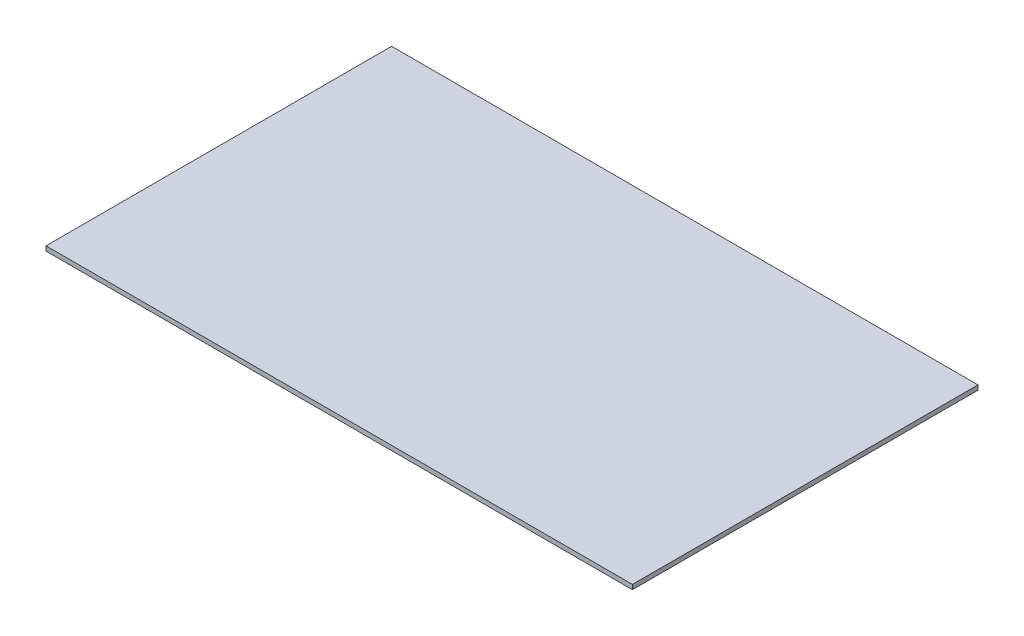
ISO-10303-21;
HEADER;
FILE_DESCRIPTION(('STEP AP214'),'2;1');
FILE_NAME('part.step','',(''),(''),'','','');
FILE_SCHEMA(('AUTOMOTIVE_DESIGN { 1 0 10303 214 1 1 1 1 }'));
ENDSEC;
DATA;
#1=APPLICATION_CONTEXT('core data for automotive mechanical design processes');
#2=APPLICATION_PROTOCOL_DEFINITION('international standard','automotive_design',2000,#1);
#3=PRODUCT_CONTEXT('',#1,'mechanical');
#4=PRODUCT('Part','Part','',(#3));
#5=PRODUCT_RELATED_PRODUCT_CATEGORY('part','',(#4));
#6=PRODUCT_DEFINITION_FORMATION('','',#4);
#7=PRODUCT_DEFINITION_CONTEXT('part definition',#1,'design');
#8=PRODUCT_DEFINITION('design','',#6,#7);
#9=PRODUCT_DEFINITION_SHAPE('','',#8);
#10=(LENGTH_UNIT() NAMED_UNIT(*) SI_UNIT(.MILLI.,.METRE.));
#11=(NAMED_UNIT(*) PLANE_ANGLE_UNIT() SI_UNIT($,.RADIAN.));
#12=(NAMED_UNIT(*) SI_UNIT($,.STERADIAN.) SOLID_ANGLE_UNIT());
#13=UNCERTAINTY_MEASURE_WITH_UNIT(LENGTH_MEASURE(1.E-05),#10,'distance_accuracy_value','');
#14=(GEOMETRIC_REPRESENTATION_CONTEXT(3) GLOBAL_UNCERTAINTY_ASSIGNED_CONTEXT((#13)) GLOBAL_UNIT_ASSIGNED_CONTEXT((#10,
#11,#12)) REPRESENTATION_CONTEXT('',''));
#15=CARTESIAN_POINT('',(0.,0.,0.));
#16=DIRECTION('',(0.,0.,1.));
#17=DIRECTION('',(1.,0.,0.));
#18=AXIS2_PLACEMENT_3D('',#15,#16,#17);
#19=CARTESIAN_POINT('',(355.6,5.55625,209.55));
#20=DIRECTION('',(-1.,0.,0.));
#21=DIRECTION('',(0.,0.,1.));
#22=AXIS2_PLACEMENT_3D('',#19,#20,#21);
#23=PLANE('',#22);
#24=DIRECTION('',(0.,0.,-1.));
#25=VECTOR('',#24,1.);
#26=CARTESIAN_POINT('',(355.6,0.,209.55));
#27=LINE('',#26,#25);
#28=CARTESIAN_POINT('',(355.6,0.,209.55));
#29=VERTEX_POINT('',#28);
#30=CARTESIAN_POINT('',(355.6,0.,-209.55));
#31=VERTEX_POINT('',#30);
#32=EDGE_CURVE('E102',#29,#31,#27,.T.);
#33=ORIENTED_EDGE('',*,*,#32,.T.);
#34=DIRECTION('',(0.,-1.,0.));
#35=VECTOR('',#34,1.);
#36=CARTESIAN_POINT('',(355.6,5.55625,-209.55));
#37=LINE('',#36,#35);
#38=CARTESIAN_POINT('',(355.6,5.55625,-209.55));
#39=VERTEX_POINT('',#38);
#40=EDGE_CURVE('E11',#39,#31,#37,.T.);
#41=ORIENTED_EDGE('',*,*,#40,.F.);
#42=DIRECTION('',(0.,0.,-1.));
#43=VECTOR('',#42,1.);
#44=CARTESIAN_POINT('',(355.6,5.55625,209.55));
#45=LINE('',#44,#43);
#46=CARTESIAN_POINT('',(355.6,5.55625,209.55));
#47=VERTEX_POINT('',#46);
#48=EDGE_CURVE('E90',#47,#39,#45,.T.);
#49=ORIENTED_EDGE('',*,*,#48,.F.);
#50=DIRECTION('',(0.,-1.,0.));
#51=VECTOR('',#50,1.);
#52=CARTESIAN_POINT('',(355.6,5.55625,209.55));
#53=LINE('',#52,#51);
#54=EDGE_CURVE('E98',#47,#29,#53,.T.);
#55=ORIENTED_EDGE('',*,*,#54,.T.);
#56=EDGE_LOOP('',(#33,#41,#49,#55));
#57=FACE_BOUND('',#56,.T.);
#58=ADVANCED_FACE('F39',(#57),#23,.F.);
#59=CARTESIAN_POINT('',(-355.6,5.55625,-209.55));
#60=DIRECTION('',(0.,0.,1.));
#61=DIRECTION('',(1.,0.,0.));
#62=AXIS2_PLACEMENT_3D('',#59,#60,#61);
#63=PLANE('',#62);
#64=DIRECTION('',(-1.,0.,0.));
#65=VECTOR('',#64,1.);
#66=CARTESIAN_POINT('',(-355.6,0.,-209.55));
#67=LINE('',#66,#65);
#68=CARTESIAN_POINT('',(-355.6,0.,-209.55));
#69=VERTEX_POINT('',#68);
#70=EDGE_CURVE('E94',#31,#69,#67,.T.);
#71=ORIENTED_EDGE('',*,*,#70,.T.);
#72=DIRECTION('',(0.,-1.,0.));
#73=VECTOR('',#72,1.);
#74=CARTESIAN_POINT('',(-355.6,5.55625,-209.55));
#75=LINE('',#74,#73);
#76=CARTESIAN_POINT('',(-355.6,5.55625,-209.55));
#77=VERTEX_POINT('',#76);
#78=EDGE_CURVE('E47',#77,#69,#75,.T.);
#79=ORIENTED_EDGE('',*,*,#78,.F.);
#80=DIRECTION('',(-1.,0.,0.));
#81=VECTOR('',#80,1.);
#82=CARTESIAN_POINT('',(-355.6,5.55625,-209.55));
#83=LINE('',#82,#81);
#84=EDGE_CURVE('E85',#39,#77,#83,.T.);
#85=ORIENTED_EDGE('',*,*,#84,.F.);
#86=ORIENTED_EDGE('',*,*,#40,.T.);
#87=EDGE_LOOP('',(#71,#79,#85,#86));
#88=FACE_BOUND('',#87,.T.);
#89=ADVANCED_FACE('F93',(#88),#63,.F.);
#90=CARTESIAN_POINT('',(-355.6,5.55625,209.55));
#91=DIRECTION('',(1.,0.,0.));
#92=DIRECTION('',(0.,0.,-1.));
#93=AXIS2_PLACEMENT_3D('',#90,#91,#92);
#94=PLANE('',#93);
#95=DIRECTION('',(0.,0.,1.));
#96=VECTOR('',#95,1.);
#97=CARTESIAN_POINT('',(-355.6,0.,209.55));
#98=LINE('',#97,#96);
#99=CARTESIAN_POINT('',(-355.6,0.,209.55));
#100=VERTEX_POINT('',#99);
#101=EDGE_CURVE('E72',#69,#100,#98,.T.);
#102=ORIENTED_EDGE('',*,*,#101,.T.);
#103=DIRECTION('',(0.,-1.,0.));
#104=VECTOR('',#103,1.);
#105=CARTESIAN_POINT('',(-355.6,5.55625,209.55));
#106=LINE('',#105,#104);
#107=CARTESIAN_POINT('',(-355.6,5.55625,209.55));
#108=VERTEX_POINT('',#107);
#109=EDGE_CURVE('E95',#108,#100,#106,.T.);
#110=ORIENTED_EDGE('',*,*,#109,.F.);
#111=DIRECTION('',(0.,0.,1.));
#112=VECTOR('',#111,1.);
#113=CARTESIAN_POINT('',(-355.6,5.55625,209.55));
#114=LINE('',#113,#112);
#115=EDGE_CURVE('E88',#77,#108,#114,.T.);
#116=ORIENTED_EDGE('',*,*,#115,.F.);
#117=ORIENTED_EDGE('',*,*,#78,.T.);
#118=EDGE_LOOP('',(#102,#110,#116,#117));
#119=FACE_BOUND('',#118,.T.);
#120=ADVANCED_FACE('F96',(#119),#94,.F.);
#121=CARTESIAN_POINT('',(-355.6,5.55625,209.55));
#122=DIRECTION('',(0.,0.,-1.));
#123=DIRECTION('',(-1.,0.,0.));
#124=AXIS2_PLACEMENT_3D('',#121,#122,#123);
#125=PLANE('',#124);
#126=DIRECTION('',(1.,0.,0.));
#127=VECTOR('',#126,1.);
#128=CARTESIAN_POINT('',(-355.6,0.,209.55));
#129=LINE('',#128,#127);
#130=EDGE_CURVE('E78',#100,#29,#129,.T.);
#131=ORIENTED_EDGE('',*,*,#130,.T.);
#132=ORIENTED_EDGE('',*,*,#54,.F.);
#133=DIRECTION('',(1.,0.,0.));
#134=VECTOR('',#133,1.);
#135=CARTESIAN_POINT('',(-355.6,5.55625,209.55));
#136=LINE('',#135,#134);
#137=EDGE_CURVE('E55',#108,#47,#136,.T.);
#138=ORIENTED_EDGE('',*,*,#137,.F.);
#139=ORIENTED_EDGE('',*,*,#109,.T.);
#140=EDGE_LOOP('',(#131,#132,#138,#139));
#141=FACE_BOUND('',#140,.T.);
#142=ADVANCED_FACE('F109',(#141),#125,.F.);
#143=CARTESIAN_POINT('',(0.,5.55625,0.));
#144=DIRECTION('',(0.,-1.,0.));
#145=DIRECTION('',(0.,0.,-1.));
#146=AXIS2_PLACEMENT_3D('',#143,#144,#145);
#147=PLANE('',#146);
#148=ORIENTED_EDGE('',*,*,#48,.T.);
#149=ORIENTED_EDGE('',*,*,#84,.T.);
#150=ORIENTED_EDGE('',*,*,#115,.T.);
#151=ORIENTED_EDGE('',*,*,#137,.T.);
#152=EDGE_LOOP('',(#148,#149,#150,#151));
#153=FACE_BOUND('',#152,.T.);
#154=ADVANCED_FACE('F86',(#153),#147,.F.);
#155=CARTESIAN_POINT('',(0.,0.,0.));
#156=DIRECTION('',(0.,-1.,0.));
#157=DIRECTION('',(0.,0.,-1.));
#158=AXIS2_PLACEMENT_3D('',#155,#156,#157);
#159=PLANE('',#158);
#160=ORIENTED_EDGE('',*,*,#32,.F.);
#161=ORIENTED_EDGE('',*,*,#130,.F.);
#162=ORIENTED_EDGE('',*,*,#101,.F.);
#163=ORIENTED_EDGE('',*,*,#70,.F.);
#164=EDGE_LOOP('',(#160,#161,#162,#163));
#165=FACE_BOUND('',#164,.T.);
#166=ADVANCED_FACE('F112',(#165),#159,.T.);
#167=CLOSED_SHELL('',(#58,#89,#120,#142,#154,#166));
#168=MANIFOLD_SOLID_BREP('B2',#167);
#169=ADVANCED_BREP_SHAPE_REPRESENTATION('',(#18,#168),#14);
#170=SHAPE_DEFINITION_REPRESENTATION(#9,#169);
ENDSEC;
END-ISO-10303-21;
